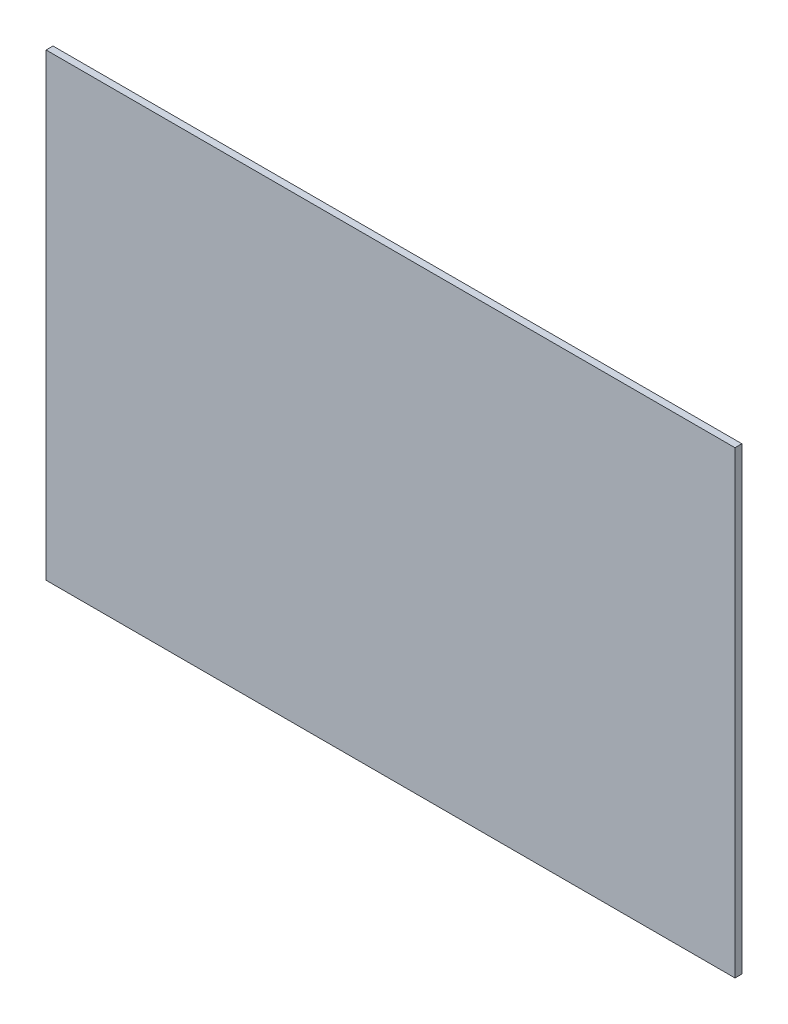
ISO-10303-21;
HEADER;
FILE_DESCRIPTION(('STEP AP214'),'2;1');
FILE_NAME('part.step','',(''),(''),'','','');
FILE_SCHEMA(('AUTOMOTIVE_DESIGN { 1 0 10303 214 1 1 1 1 }'));
ENDSEC;
DATA;
#1=APPLICATION_CONTEXT('core data for automotive mechanical design processes');
#2=APPLICATION_PROTOCOL_DEFINITION('international standard','automotive_design',2000,#1);
#3=PRODUCT_CONTEXT('',#1,'mechanical');
#4=PRODUCT('Part','Part','',(#3));
#5=PRODUCT_RELATED_PRODUCT_CATEGORY('part','',(#4));
#6=PRODUCT_DEFINITION_FORMATION('','',#4);
#7=PRODUCT_DEFINITION_CONTEXT('part definition',#1,'design');
#8=PRODUCT_DEFINITION('design','',#6,#7);
#9=PRODUCT_DEFINITION_SHAPE('','',#8);
#10=(LENGTH_UNIT() NAMED_UNIT(*) SI_UNIT(.MILLI.,.METRE.));
#11=(NAMED_UNIT(*) PLANE_ANGLE_UNIT() SI_UNIT($,.RADIAN.));
#12=(NAMED_UNIT(*) SI_UNIT($,.STERADIAN.) SOLID_ANGLE_UNIT());
#13=UNCERTAINTY_MEASURE_WITH_UNIT(LENGTH_MEASURE(1.E-05),#10,'distance_accuracy_value','');
#14=(GEOMETRIC_REPRESENTATION_CONTEXT(3) GLOBAL_UNCERTAINTY_ASSIGNED_CONTEXT((#13)) GLOBAL_UNIT_ASSIGNED_CONTEXT((#10,
#11,#12)) REPRESENTATION_CONTEXT('',''));
#15=CARTESIAN_POINT('',(0.,0.,0.));
#16=DIRECTION('',(0.,0.,1.));
#17=DIRECTION('',(1.,0.,0.));
#18=AXIS2_PLACEMENT_3D('',#15,#16,#17);
#19=CARTESIAN_POINT('',(150.,100.,3.));
#20=DIRECTION('',(-1.,0.,0.));
#21=DIRECTION('',(0.,0.,1.));
#22=AXIS2_PLACEMENT_3D('',#19,#20,#21);
#23=PLANE('',#22);
#24=DIRECTION('',(0.,1.,0.));
#25=VECTOR('',#24,1.);
#26=CARTESIAN_POINT('',(150.,100.,0.));
#27=LINE('',#26,#25);
#28=CARTESIAN_POINT('',(150.,-100.,0.));
#29=VERTEX_POINT('',#28);
#30=CARTESIAN_POINT('',(150.,100.,0.));
#31=VERTEX_POINT('',#30);
#32=EDGE_CURVE('E107',#29,#31,#27,.T.);
#33=ORIENTED_EDGE('',*,*,#32,.T.);
#34=DIRECTION('',(0.,0.,-1.));
#35=VECTOR('',#34,1.);
#36=CARTESIAN_POINT('',(150.,100.,3.));
#37=LINE('',#36,#35);
#38=CARTESIAN_POINT('',(150.,100.,3.));
#39=VERTEX_POINT('',#38);
#40=EDGE_CURVE('E11',#39,#31,#37,.T.);
#41=ORIENTED_EDGE('',*,*,#40,.F.);
#42=DIRECTION('',(0.,1.,0.));
#43=VECTOR('',#42,1.);
#44=CARTESIAN_POINT('',(150.,100.,3.));
#45=LINE('',#44,#43);
#46=CARTESIAN_POINT('',(150.,-100.,3.));
#47=VERTEX_POINT('',#46);
#48=EDGE_CURVE('E91',#47,#39,#45,.T.);
#49=ORIENTED_EDGE('',*,*,#48,.F.);
#50=DIRECTION('',(0.,0.,-1.));
#51=VECTOR('',#50,1.);
#52=CARTESIAN_POINT('',(150.,-100.,3.));
#53=LINE('',#52,#51);
#54=EDGE_CURVE('E103',#47,#29,#53,.T.);
#55=ORIENTED_EDGE('',*,*,#54,.T.);
#56=EDGE_LOOP('',(#33,#41,#49,#55));
#57=FACE_BOUND('',#56,.T.);
#58=ADVANCED_FACE('F39',(#57),#23,.F.);
#59=CARTESIAN_POINT('',(-150.,100.,3.));
#60=DIRECTION('',(0.,-1.,0.));
#61=DIRECTION('',(0.,0.,-1.));
#62=AXIS2_PLACEMENT_3D('',#59,#60,#61);
#63=PLANE('',#62);
#64=DIRECTION('',(-1.,0.,0.));
#65=VECTOR('',#64,1.);
#66=CARTESIAN_POINT('',(-150.,100.,0.));
#67=LINE('',#66,#65);
#68=CARTESIAN_POINT('',(-150.,100.,0.));
#69=VERTEX_POINT('',#68);
#70=EDGE_CURVE('E96',#31,#69,#67,.T.);
#71=ORIENTED_EDGE('',*,*,#70,.T.);
#72=DIRECTION('',(0.,0.,-1.));
#73=VECTOR('',#72,1.);
#74=CARTESIAN_POINT('',(-150.,100.,3.));
#75=LINE('',#74,#73);
#76=CARTESIAN_POINT('',(-150.,100.,3.));
#77=VERTEX_POINT('',#76);
#78=EDGE_CURVE('E48',#77,#69,#75,.T.);
#79=ORIENTED_EDGE('',*,*,#78,.F.);
#80=DIRECTION('',(-1.,0.,0.));
#81=VECTOR('',#80,1.);
#82=CARTESIAN_POINT('',(-150.,100.,3.));
#83=LINE('',#82,#81);
#84=EDGE_CURVE('E86',#39,#77,#83,.T.);
#85=ORIENTED_EDGE('',*,*,#84,.F.);
#86=ORIENTED_EDGE('',*,*,#40,.T.);
#87=EDGE_LOOP('',(#71,#79,#85,#86));
#88=FACE_BOUND('',#87,.T.);
#89=ADVANCED_FACE('F95',(#88),#63,.F.);
#90=CARTESIAN_POINT('',(-150.,100.,3.));
#91=DIRECTION('',(1.,0.,0.));
#92=DIRECTION('',(0.,0.,-1.));
#93=AXIS2_PLACEMENT_3D('',#90,#91,#92);
#94=PLANE('',#93);
#95=DIRECTION('',(0.,-1.,0.));
#96=VECTOR('',#95,1.);
#97=CARTESIAN_POINT('',(-150.,100.,0.));
#98=LINE('',#97,#96);
#99=CARTESIAN_POINT('',(-150.,-100.,0.));
#100=VERTEX_POINT('',#99);
#101=EDGE_CURVE('E73',#69,#100,#98,.T.);
#102=ORIENTED_EDGE('',*,*,#101,.T.);
#103=DIRECTION('',(0.,0.,-1.));
#104=VECTOR('',#103,1.);
#105=CARTESIAN_POINT('',(-150.,-100.,3.));
#106=LINE('',#105,#104);
#107=CARTESIAN_POINT('',(-150.,-100.,3.));
#108=VERTEX_POINT('',#107);
#109=EDGE_CURVE('E98',#108,#100,#106,.T.);
#110=ORIENTED_EDGE('',*,*,#109,.F.);
#111=DIRECTION('',(0.,-1.,0.));
#112=VECTOR('',#111,1.);
#113=CARTESIAN_POINT('',(-150.,100.,3.));
#114=LINE('',#113,#112);
#115=EDGE_CURVE('E89',#77,#108,#114,.T.);
#116=ORIENTED_EDGE('',*,*,#115,.F.);
#117=ORIENTED_EDGE('',*,*,#78,.T.);
#118=EDGE_LOOP('',(#102,#110,#116,#117));
#119=FACE_BOUND('',#118,.T.);
#120=ADVANCED_FACE('F99',(#119),#94,.F.);
#121=CARTESIAN_POINT('',(-150.,-100.,3.));
#122=DIRECTION('',(0.,1.,0.));
#123=DIRECTION('',(0.,0.,1.));
#124=AXIS2_PLACEMENT_3D('',#121,#122,#123);
#125=PLANE('',#124);
#126=DIRECTION('',(1.,0.,0.));
#127=VECTOR('',#126,1.);
#128=CARTESIAN_POINT('',(-150.,-100.,0.));
#129=LINE('',#128,#127);
#130=EDGE_CURVE('E79',#100,#29,#129,.T.);
#131=ORIENTED_EDGE('',*,*,#130,.T.);
#132=ORIENTED_EDGE('',*,*,#54,.F.);
#133=DIRECTION('',(1.,0.,0.));
#134=VECTOR('',#133,1.);
#135=CARTESIAN_POINT('',(-150.,-100.,3.));
#136=LINE('',#135,#134);
#137=EDGE_CURVE('E56',#108,#47,#136,.T.);
#138=ORIENTED_EDGE('',*,*,#137,.F.);
#139=ORIENTED_EDGE('',*,*,#109,.T.);
#140=EDGE_LOOP('',(#131,#132,#138,#139));
#141=FACE_BOUND('',#140,.T.);
#142=ADVANCED_FACE('F120',(#141),#125,.F.);
#143=CARTESIAN_POINT('',(0.,0.,3.));
#144=DIRECTION('',(0.,0.,1.));
#145=DIRECTION('',(1.,0.,0.));
#146=AXIS2_PLACEMENT_3D('',#143,#144,#145);
#147=PLANE('',#146);
#148=ORIENTED_EDGE('',*,*,#48,.T.);
#149=ORIENTED_EDGE('',*,*,#84,.T.);
#150=ORIENTED_EDGE('',*,*,#115,.T.);
#151=ORIENTED_EDGE('',*,*,#137,.T.);
#152=EDGE_LOOP('',(#148,#149,#150,#151));
#153=FACE_BOUND('',#152,.T.);
#154=ADVANCED_FACE('F87',(#153),#147,.T.);
#155=CARTESIAN_POINT('',(0.,0.,0.));
#156=DIRECTION('',(0.,0.,1.));
#157=DIRECTION('',(1.,0.,0.));
#158=AXIS2_PLACEMENT_3D('',#155,#156,#157);
#159=PLANE('',#158);
#160=ORIENTED_EDGE('',*,*,#32,.F.);
#161=ORIENTED_EDGE('',*,*,#130,.F.);
#162=ORIENTED_EDGE('',*,*,#101,.F.);
#163=ORIENTED_EDGE('',*,*,#70,.F.);
#164=EDGE_LOOP('',(#160,#161,#162,#163));
#165=FACE_BOUND('',#164,.T.);
#166=ADVANCED_FACE('F123',(#165),#159,.F.);
#167=CLOSED_SHELL('',(#58,#89,#120,#142,#154,#166));
#168=MANIFOLD_SOLID_BREP('B2',#167);
#169=ADVANCED_BREP_SHAPE_REPRESENTATION('',(#18,#168),#14);
#170=SHAPE_DEFINITION_REPRESENTATION(#9,#169);
ENDSEC;
END-ISO-10303-21;
